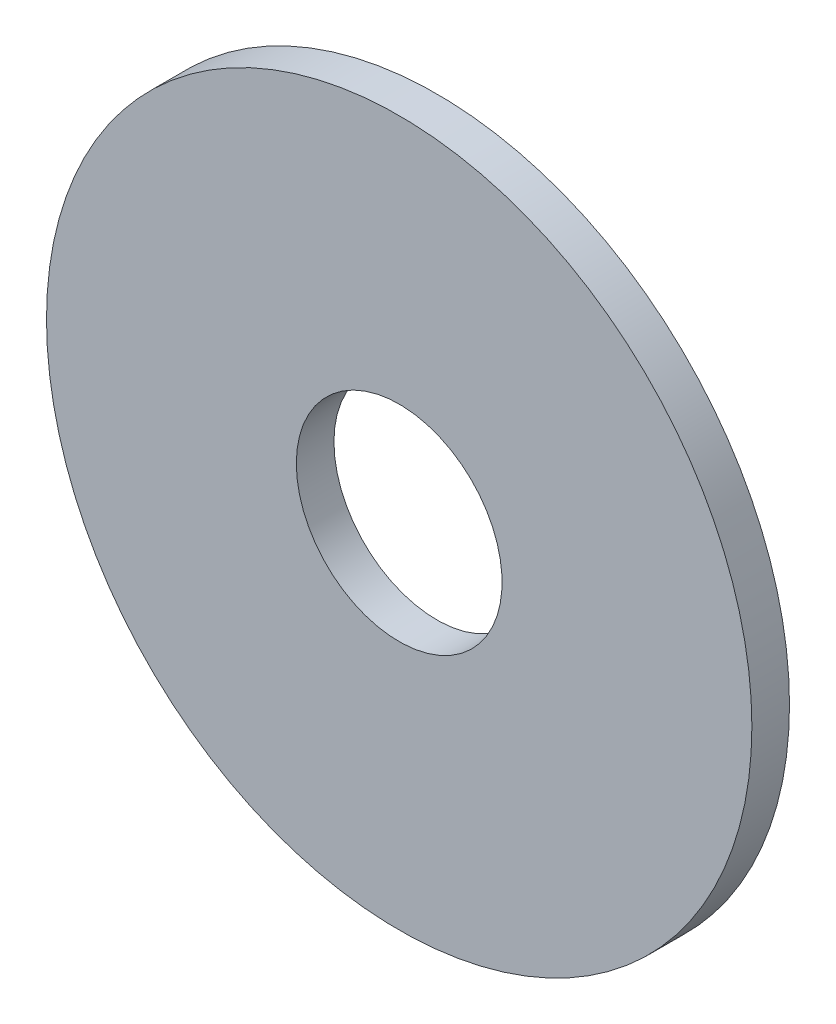
ISO-10303-21;
HEADER;
FILE_DESCRIPTION(('STEP AP214'),'2;1');
FILE_NAME('part.step','',(''),(''),'','','');
FILE_SCHEMA(('AUTOMOTIVE_DESIGN { 1 0 10303 214 1 1 1 1 }'));
ENDSEC;
DATA;
#1=APPLICATION_CONTEXT('core data for automotive mechanical design processes');
#2=APPLICATION_PROTOCOL_DEFINITION('international standard','automotive_design',2000,#1);
#3=PRODUCT_CONTEXT('',#1,'mechanical');
#4=PRODUCT('Part','Part','',(#3));
#5=PRODUCT_RELATED_PRODUCT_CATEGORY('part','',(#4));
#6=PRODUCT_DEFINITION_FORMATION('','',#4);
#7=PRODUCT_DEFINITION_CONTEXT('part definition',#1,'design');
#8=PRODUCT_DEFINITION('design','',#6,#7);
#9=PRODUCT_DEFINITION_SHAPE('','',#8);
#10=(LENGTH_UNIT() NAMED_UNIT(*) SI_UNIT(.MILLI.,.METRE.));
#11=(NAMED_UNIT(*) PLANE_ANGLE_UNIT() SI_UNIT($,.RADIAN.));
#12=(NAMED_UNIT(*) SI_UNIT($,.STERADIAN.) SOLID_ANGLE_UNIT());
#13=UNCERTAINTY_MEASURE_WITH_UNIT(LENGTH_MEASURE(1.E-05),#10,'distance_accuracy_value','');
#14=(GEOMETRIC_REPRESENTATION_CONTEXT(3) GLOBAL_UNCERTAINTY_ASSIGNED_CONTEXT((#13)) GLOBAL_UNIT_ASSIGNED_CONTEXT((#10,
#11,#12)) REPRESENTATION_CONTEXT('',''));
#15=CARTESIAN_POINT('',(0.,0.,0.));
#16=DIRECTION('',(0.,0.,1.));
#17=DIRECTION('',(1.,0.,0.));
#18=AXIS2_PLACEMENT_3D('',#15,#16,#17);
#19=CARTESIAN_POINT('',(0.,0.,0.));
#20=DIRECTION('',(0.,0.,-1.));
#21=DIRECTION('',(-1.,0.,0.));
#22=AXIS2_PLACEMENT_3D('',#19,#20,#21);
#23=CYLINDRICAL_SURFACE('',#22,19.05);
#24=CARTESIAN_POINT('',(0.,0.,0.));
#25=DIRECTION('',(0.,0.,-1.));
#26=DIRECTION('',(-1.,0.,0.));
#27=AXIS2_PLACEMENT_3D('',#24,#25,#26);
#28=CIRCLE('',#27,19.05);
#29=CARTESIAN_POINT('',(-19.05,0.,0.));
#30=VERTEX_POINT('',#29);
#31=EDGE_CURVE('E47',#30,#30,#28,.T.);
#32=ORIENTED_EDGE('',*,*,#31,.F.);
#33=EDGE_LOOP('',(#32));
#34=FACE_BOUND('',#33,.T.);
#35=CARTESIAN_POINT('',(0.,0.,2.032));
#36=DIRECTION('',(0.,0.,-1.));
#37=DIRECTION('',(-1.,0.,0.));
#38=AXIS2_PLACEMENT_3D('',#35,#36,#37);
#39=CIRCLE('',#38,19.05);
#40=CARTESIAN_POINT('',(-19.05,0.,2.032));
#41=VERTEX_POINT('',#40);
#42=EDGE_CURVE('E10',#41,#41,#39,.T.);
#43=ORIENTED_EDGE('',*,*,#42,.T.);
#44=EDGE_LOOP('',(#43));
#45=FACE_BOUND('',#44,.T.);
#46=ADVANCED_FACE('F33',(#34,#45),#23,.T.);
#47=CARTESIAN_POINT('',(0.,0.,2.032));
#48=DIRECTION('',(0.,0.,-1.));
#49=DIRECTION('',(-1.,0.,0.));
#50=AXIS2_PLACEMENT_3D('',#47,#48,#49);
#51=PLANE('',#50);
#52=ORIENTED_EDGE('',*,*,#42,.F.);
#53=EDGE_LOOP('',(#52));
#54=FACE_BOUND('',#53,.T.);
#55=CARTESIAN_POINT('',(0.,0.,2.032));
#56=DIRECTION('',(0.,0.,-1.));
#57=DIRECTION('',(-1.,0.,0.));
#58=AXIS2_PLACEMENT_3D('',#55,#56,#57);
#59=CIRCLE('',#58,5.55625);
#60=CARTESIAN_POINT('',(-5.55625,0.,2.032));
#61=VERTEX_POINT('',#60);
#62=EDGE_CURVE('E39',#61,#61,#59,.T.);
#63=ORIENTED_EDGE('',*,*,#62,.T.);
#64=EDGE_LOOP('',(#63));
#65=FACE_BOUND('',#64,.T.);
#66=ADVANCED_FACE('F57',(#54,#65),#51,.F.);
#67=CARTESIAN_POINT('',(0.,0.,0.));
#68=DIRECTION('',(0.,0.,-1.));
#69=DIRECTION('',(-1.,0.,0.));
#70=AXIS2_PLACEMENT_3D('',#67,#68,#69);
#71=CYLINDRICAL_SURFACE('',#70,5.55625);
#72=ORIENTED_EDGE('',*,*,#62,.F.);
#73=EDGE_LOOP('',(#72));
#74=FACE_BOUND('',#73,.T.);
#75=CARTESIAN_POINT('',(0.,0.,0.));
#76=DIRECTION('',(0.,0.,-1.));
#77=DIRECTION('',(-1.,0.,0.));
#78=AXIS2_PLACEMENT_3D('',#75,#76,#77);
#79=CIRCLE('',#78,5.55625);
#80=CARTESIAN_POINT('',(-5.55625,0.,0.));
#81=VERTEX_POINT('',#80);
#82=EDGE_CURVE('E43',#81,#81,#79,.T.);
#83=ORIENTED_EDGE('',*,*,#82,.T.);
#84=EDGE_LOOP('',(#83));
#85=FACE_BOUND('',#84,.T.);
#86=ADVANCED_FACE('F61',(#74,#85),#71,.F.);
#87=CARTESIAN_POINT('',(0.,0.,0.));
#88=DIRECTION('',(0.,0.,-1.));
#89=DIRECTION('',(-1.,0.,0.));
#90=AXIS2_PLACEMENT_3D('',#87,#88,#89);
#91=PLANE('',#90);
#92=ORIENTED_EDGE('',*,*,#31,.T.);
#93=EDGE_LOOP('',(#92));
#94=FACE_BOUND('',#93,.T.);
#95=ORIENTED_EDGE('',*,*,#82,.F.);
#96=EDGE_LOOP('',(#95));
#97=FACE_BOUND('',#96,.T.);
#98=ADVANCED_FACE('F53',(#94,#97),#91,.T.);
#99=CLOSED_SHELL('',(#46,#66,#86,#98));
#100=MANIFOLD_SOLID_BREP('B2',#99);
#101=ADVANCED_BREP_SHAPE_REPRESENTATION('',(#18,#100),#14);
#102=SHAPE_DEFINITION_REPRESENTATION(#9,#101);
ENDSEC;
END-ISO-10303-21;
